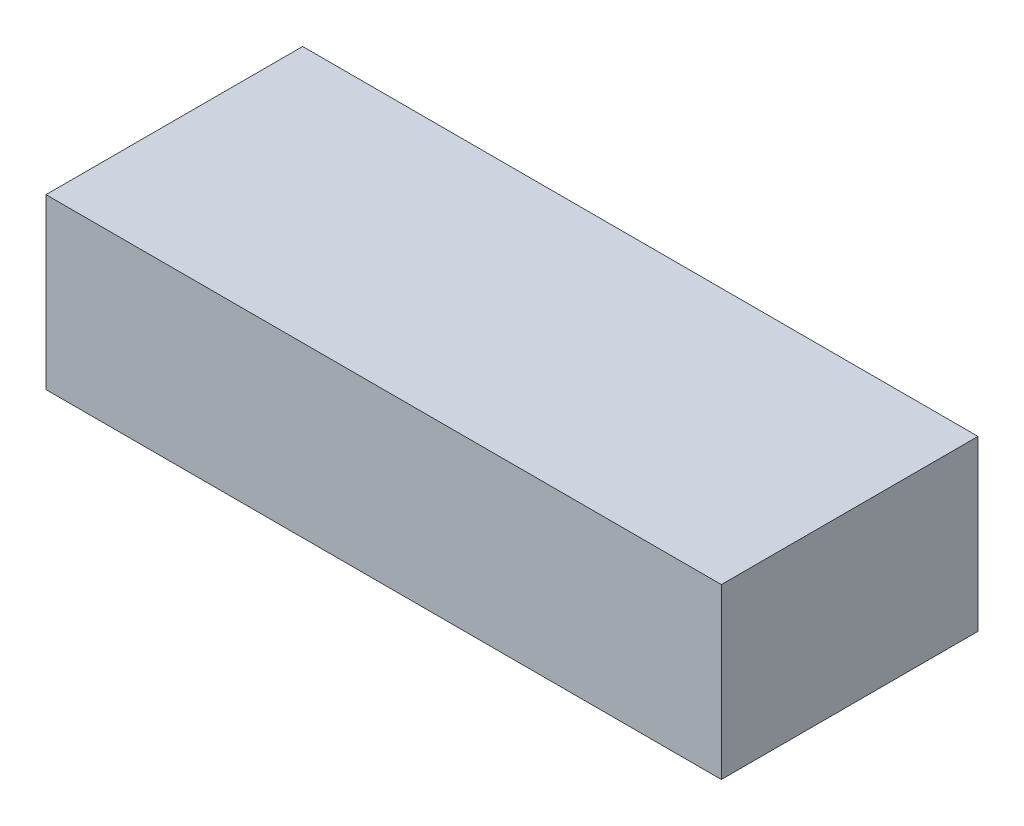
ISO-10303-21;
HEADER;
FILE_DESCRIPTION(('STEP AP214'),'2;1');
FILE_NAME('part.step','',(''),(''),'','','');
FILE_SCHEMA(('AUTOMOTIVE_DESIGN { 1 0 10303 214 1 1 1 1 }'));
ENDSEC;
DATA;
#1=APPLICATION_CONTEXT('core data for automotive mechanical design processes');
#2=APPLICATION_PROTOCOL_DEFINITION('international standard','automotive_design',2000,#1);
#3=PRODUCT_CONTEXT('',#1,'mechanical');
#4=PRODUCT('Part','Part','',(#3));
#5=PRODUCT_RELATED_PRODUCT_CATEGORY('part','',(#4));
#6=PRODUCT_DEFINITION_FORMATION('','',#4);
#7=PRODUCT_DEFINITION_CONTEXT('part definition',#1,'design');
#8=PRODUCT_DEFINITION('design','',#6,#7);
#9=PRODUCT_DEFINITION_SHAPE('','',#8);
#10=(LENGTH_UNIT() NAMED_UNIT(*) SI_UNIT(.MILLI.,.METRE.));
#11=(NAMED_UNIT(*) PLANE_ANGLE_UNIT() SI_UNIT($,.RADIAN.));
#12=(NAMED_UNIT(*) SI_UNIT($,.STERADIAN.) SOLID_ANGLE_UNIT());
#13=UNCERTAINTY_MEASURE_WITH_UNIT(LENGTH_MEASURE(1.E-05),#10,'distance_accuracy_value','');
#14=(GEOMETRIC_REPRESENTATION_CONTEXT(3) GLOBAL_UNCERTAINTY_ASSIGNED_CONTEXT((#13)) GLOBAL_UNIT_ASSIGNED_CONTEXT((#10,
#11,#12)) REPRESENTATION_CONTEXT('',''));
#15=CARTESIAN_POINT('',(0.,0.,0.));
#16=DIRECTION('',(0.,0.,1.));
#17=DIRECTION('',(1.,0.,0.));
#18=AXIS2_PLACEMENT_3D('',#15,#16,#17);
#19=CARTESIAN_POINT('',(0.,25.,0.));
#20=DIRECTION('',(1.,0.,0.));
#21=DIRECTION('',(0.,0.,-1.));
#22=AXIS2_PLACEMENT_3D('',#19,#20,#21);
#23=PLANE('',#22);
#24=DIRECTION('',(0.,0.,1.));
#25=VECTOR('',#24,1.);
#26=CARTESIAN_POINT('',(0.,0.,0.));
#27=LINE('',#26,#25);
#28=CARTESIAN_POINT('',(0.,0.,0.));
#29=VERTEX_POINT('',#28);
#30=CARTESIAN_POINT('',(0.,0.,38.));
#31=VERTEX_POINT('',#30);
#32=EDGE_CURVE('E106',#29,#31,#27,.T.);
#33=ORIENTED_EDGE('',*,*,#32,.T.);
#34=DIRECTION('',(0.,-1.,0.));
#35=VECTOR('',#34,1.);
#36=CARTESIAN_POINT('',(0.,25.,38.));
#37=LINE('',#36,#35);
#38=CARTESIAN_POINT('',(0.,25.,38.));
#39=VERTEX_POINT('',#38);
#40=EDGE_CURVE('E11',#39,#31,#37,.T.);
#41=ORIENTED_EDGE('',*,*,#40,.F.);
#42=DIRECTION('',(0.,0.,1.));
#43=VECTOR('',#42,1.);
#44=CARTESIAN_POINT('',(0.,25.,0.));
#45=LINE('',#44,#43);
#46=CARTESIAN_POINT('',(0.,25.,0.));
#47=VERTEX_POINT('',#46);
#48=EDGE_CURVE('E94',#47,#39,#45,.T.);
#49=ORIENTED_EDGE('',*,*,#48,.F.);
#50=DIRECTION('',(0.,-1.,0.));
#51=VECTOR('',#50,1.);
#52=CARTESIAN_POINT('',(0.,25.,0.));
#53=LINE('',#52,#51);
#54=EDGE_CURVE('E102',#47,#29,#53,.T.);
#55=ORIENTED_EDGE('',*,*,#54,.T.);
#56=EDGE_LOOP('',(#33,#41,#49,#55));
#57=FACE_BOUND('',#56,.T.);
#58=ADVANCED_FACE('F43',(#57),#23,.F.);
#59=CARTESIAN_POINT('',(0.,25.,38.));
#60=DIRECTION('',(0.,0.,-1.));
#61=DIRECTION('',(-1.,0.,0.));
#62=AXIS2_PLACEMENT_3D('',#59,#60,#61);
#63=PLANE('',#62);
#64=DIRECTION('',(1.,0.,0.));
#65=VECTOR('',#64,1.);
#66=CARTESIAN_POINT('',(0.,0.,38.));
#67=LINE('',#66,#65);
#68=CARTESIAN_POINT('',(100.,0.,38.));
#69=VERTEX_POINT('',#68);
#70=EDGE_CURVE('E98',#31,#69,#67,.T.);
#71=ORIENTED_EDGE('',*,*,#70,.T.);
#72=DIRECTION('',(0.,-1.,0.));
#73=VECTOR('',#72,1.);
#74=CARTESIAN_POINT('',(100.,25.,38.));
#75=LINE('',#74,#73);
#76=CARTESIAN_POINT('',(100.,25.,38.));
#77=VERTEX_POINT('',#76);
#78=EDGE_CURVE('E51',#77,#69,#75,.T.);
#79=ORIENTED_EDGE('',*,*,#78,.F.);
#80=DIRECTION('',(1.,0.,0.));
#81=VECTOR('',#80,1.);
#82=CARTESIAN_POINT('',(0.,25.,38.));
#83=LINE('',#82,#81);
#84=EDGE_CURVE('E89',#39,#77,#83,.T.);
#85=ORIENTED_EDGE('',*,*,#84,.F.);
#86=ORIENTED_EDGE('',*,*,#40,.T.);
#87=EDGE_LOOP('',(#71,#79,#85,#86));
#88=FACE_BOUND('',#87,.T.);
#89=ADVANCED_FACE('F97',(#88),#63,.F.);
#90=CARTESIAN_POINT('',(100.,25.,0.));
#91=DIRECTION('',(-1.,0.,0.));
#92=DIRECTION('',(0.,0.,1.));
#93=AXIS2_PLACEMENT_3D('',#90,#91,#92);
#94=PLANE('',#93);
#95=DIRECTION('',(0.,0.,-1.));
#96=VECTOR('',#95,1.);
#97=CARTESIAN_POINT('',(100.,0.,0.));
#98=LINE('',#97,#96);
#99=CARTESIAN_POINT('',(100.,0.,0.));
#100=VERTEX_POINT('',#99);
#101=EDGE_CURVE('E76',#69,#100,#98,.T.);
#102=ORIENTED_EDGE('',*,*,#101,.T.);
#103=DIRECTION('',(0.,-1.,0.));
#104=VECTOR('',#103,1.);
#105=CARTESIAN_POINT('',(100.,25.,0.));
#106=LINE('',#105,#104);
#107=CARTESIAN_POINT('',(100.,25.,0.));
#108=VERTEX_POINT('',#107);
#109=EDGE_CURVE('E99',#108,#100,#106,.T.);
#110=ORIENTED_EDGE('',*,*,#109,.F.);
#111=DIRECTION('',(0.,0.,-1.));
#112=VECTOR('',#111,1.);
#113=CARTESIAN_POINT('',(100.,25.,0.));
#114=LINE('',#113,#112);
#115=EDGE_CURVE('E92',#77,#108,#114,.T.);
#116=ORIENTED_EDGE('',*,*,#115,.F.);
#117=ORIENTED_EDGE('',*,*,#78,.T.);
#118=EDGE_LOOP('',(#102,#110,#116,#117));
#119=FACE_BOUND('',#118,.T.);
#120=ADVANCED_FACE('F100',(#119),#94,.F.);
#121=CARTESIAN_POINT('',(0.,25.,0.));
#122=DIRECTION('',(0.,0.,1.));
#123=DIRECTION('',(1.,0.,0.));
#124=AXIS2_PLACEMENT_3D('',#121,#122,#123);
#125=PLANE('',#124);
#126=DIRECTION('',(-1.,0.,0.));
#127=VECTOR('',#126,1.);
#128=CARTESIAN_POINT('',(0.,0.,0.));
#129=LINE('',#128,#127);
#130=EDGE_CURVE('E82',#100,#29,#129,.T.);
#131=ORIENTED_EDGE('',*,*,#130,.T.);
#132=ORIENTED_EDGE('',*,*,#54,.F.);
#133=DIRECTION('',(-1.,0.,0.));
#134=VECTOR('',#133,1.);
#135=CARTESIAN_POINT('',(0.,25.,0.));
#136=LINE('',#135,#134);
#137=EDGE_CURVE('E59',#108,#47,#136,.T.);
#138=ORIENTED_EDGE('',*,*,#137,.F.);
#139=ORIENTED_EDGE('',*,*,#109,.T.);
#140=EDGE_LOOP('',(#131,#132,#138,#139));
#141=FACE_BOUND('',#140,.T.);
#142=ADVANCED_FACE('F113',(#141),#125,.F.);
#143=CARTESIAN_POINT('',(0.,25.,0.));
#144=DIRECTION('',(0.,1.,0.));
#145=DIRECTION('',(0.,0.,1.));
#146=AXIS2_PLACEMENT_3D('',#143,#144,#145);
#147=PLANE('',#146);
#148=ORIENTED_EDGE('',*,*,#48,.T.);
#149=ORIENTED_EDGE('',*,*,#84,.T.);
#150=ORIENTED_EDGE('',*,*,#115,.T.);
#151=ORIENTED_EDGE('',*,*,#137,.T.);
#152=EDGE_LOOP('',(#148,#149,#150,#151));
#153=FACE_BOUND('',#152,.T.);
#154=ADVANCED_FACE('F90',(#153),#147,.T.);
#155=CARTESIAN_POINT('',(0.,0.,0.));
#156=DIRECTION('',(0.,1.,0.));
#157=DIRECTION('',(0.,0.,1.));
#158=AXIS2_PLACEMENT_3D('',#155,#156,#157);
#159=PLANE('',#158);
#160=ORIENTED_EDGE('',*,*,#32,.F.);
#161=ORIENTED_EDGE('',*,*,#130,.F.);
#162=ORIENTED_EDGE('',*,*,#101,.F.);
#163=ORIENTED_EDGE('',*,*,#70,.F.);
#164=EDGE_LOOP('',(#160,#161,#162,#163));
#165=FACE_BOUND('',#164,.T.);
#166=ADVANCED_FACE('F116',(#165),#159,.F.);
#167=CLOSED_SHELL('',(#58,#89,#120,#142,#154,#166));
#168=MANIFOLD_SOLID_BREP('B2',#167);
#169=ADVANCED_BREP_SHAPE_REPRESENTATION('',(#18,#168),#14);
#170=SHAPE_DEFINITION_REPRESENTATION(#9,#169);
ENDSEC;
END-ISO-10303-21;
